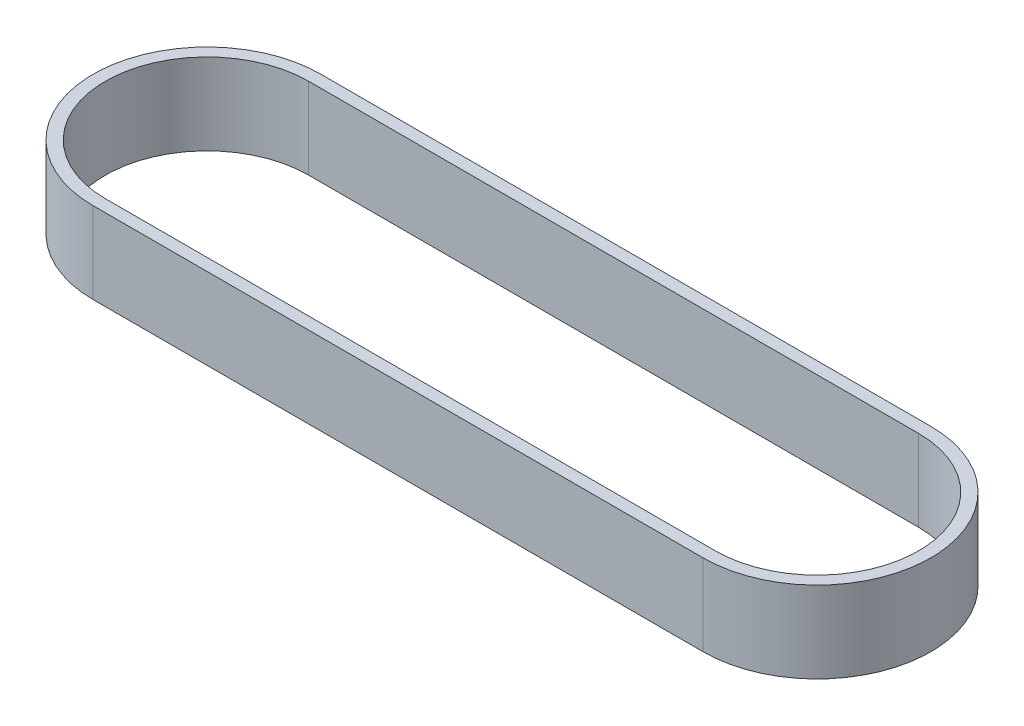
ISO-10303-21;
HEADER;
FILE_DESCRIPTION(('STEP AP214'),'2;1');
FILE_NAME('part.step','',(''),(''),'','','');
FILE_SCHEMA(('AUTOMOTIVE_DESIGN { 1 0 10303 214 1 1 1 1 }'));
ENDSEC;
DATA;
#1=APPLICATION_CONTEXT('core data for automotive mechanical design processes');
#2=APPLICATION_PROTOCOL_DEFINITION('international standard','automotive_design',2000,#1);
#3=PRODUCT_CONTEXT('',#1,'mechanical');
#4=PRODUCT('Part','Part','',(#3));
#5=PRODUCT_RELATED_PRODUCT_CATEGORY('part','',(#4));
#6=PRODUCT_DEFINITION_FORMATION('','',#4);
#7=PRODUCT_DEFINITION_CONTEXT('part definition',#1,'design');
#8=PRODUCT_DEFINITION('design','',#6,#7);
#9=PRODUCT_DEFINITION_SHAPE('','',#8);
#10=(LENGTH_UNIT() NAMED_UNIT(*) SI_UNIT(.MILLI.,.METRE.));
#11=(NAMED_UNIT(*) PLANE_ANGLE_UNIT() SI_UNIT($,.RADIAN.));
#12=(NAMED_UNIT(*) SI_UNIT($,.STERADIAN.) SOLID_ANGLE_UNIT());
#13=UNCERTAINTY_MEASURE_WITH_UNIT(LENGTH_MEASURE(1.E-05),#10,'distance_accuracy_value','');
#14=(GEOMETRIC_REPRESENTATION_CONTEXT(3) GLOBAL_UNCERTAINTY_ASSIGNED_CONTEXT((#13)) GLOBAL_UNIT_ASSIGNED_CONTEXT((#10,
#11,#12)) REPRESENTATION_CONTEXT('',''));
#15=CARTESIAN_POINT('',(0.,0.,0.));
#16=DIRECTION('',(0.,0.,1.));
#17=DIRECTION('',(1.,0.,0.));
#18=AXIS2_PLACEMENT_3D('',#15,#16,#17);
#19=CARTESIAN_POINT('',(-150.,40.,0.));
#20=DIRECTION('',(0.,1.,0.));
#21=DIRECTION('',(0.,0.,1.));
#22=AXIS2_PLACEMENT_3D('',#19,#20,#21);
#23=PLANE('',#22);
#24=CARTESIAN_POINT('',(-150.,40.,0.));
#25=DIRECTION('',(0.,1.,0.));
#26=DIRECTION('',(0.,0.,1.));
#27=AXIS2_PLACEMENT_3D('',#24,#25,#26);
#28=CIRCLE('',#27,56.);
#29=CARTESIAN_POINT('',(-150.,40.,-56.));
#30=VERTEX_POINT('',#29);
#31=CARTESIAN_POINT('',(-150.,40.,56.));
#32=VERTEX_POINT('',#31);
#33=EDGE_CURVE('E153',#30,#32,#28,.T.);
#34=ORIENTED_EDGE('',*,*,#33,.T.);
#35=DIRECTION('',(1.,0.,0.));
#36=VECTOR('',#35,1.);
#37=CARTESIAN_POINT('',(-150.,40.,56.));
#38=LINE('',#37,#36);
#39=CARTESIAN_POINT('',(150.,40.,56.));
#40=VERTEX_POINT('',#39);
#41=EDGE_CURVE('E157',#32,#40,#38,.T.);
#42=ORIENTED_EDGE('',*,*,#41,.T.);
#43=CARTESIAN_POINT('',(150.,40.,0.));
#44=DIRECTION('',(0.,1.,0.));
#45=DIRECTION('',(0.,0.,1.));
#46=AXIS2_PLACEMENT_3D('',#43,#44,#45);
#47=CIRCLE('',#46,56.);
#48=CARTESIAN_POINT('',(150.,40.,-56.));
#49=VERTEX_POINT('',#48);
#50=EDGE_CURVE('E161',#40,#49,#47,.T.);
#51=ORIENTED_EDGE('',*,*,#50,.T.);
#52=DIRECTION('',(-1.,0.,0.));
#53=VECTOR('',#52,1.);
#54=CARTESIAN_POINT('',(-150.,40.,-56.));
#55=LINE('',#54,#53);
#56=EDGE_CURVE('E164',#49,#30,#55,.T.);
#57=ORIENTED_EDGE('',*,*,#56,.T.);
#58=EDGE_LOOP('',(#34,#42,#51,#57));
#59=FACE_BOUND('',#58,.T.);
#60=DIRECTION('',(1.,0.,0.));
#61=VECTOR('',#60,1.);
#62=CARTESIAN_POINT('',(-150.,40.,50.));
#63=LINE('',#62,#61);
#64=CARTESIAN_POINT('',(-150.,40.,50.));
#65=VERTEX_POINT('',#64);
#66=CARTESIAN_POINT('',(150.,40.,50.));
#67=VERTEX_POINT('',#66);
#68=EDGE_CURVE('E114',#65,#67,#63,.T.);
#69=ORIENTED_EDGE('',*,*,#68,.F.);
#70=CARTESIAN_POINT('',(-150.,40.,0.));
#71=DIRECTION('',(0.,1.,0.));
#72=DIRECTION('',(0.,0.,1.));
#73=AXIS2_PLACEMENT_3D('',#70,#71,#72);
#74=CIRCLE('',#73,50.);
#75=CARTESIAN_POINT('',(-150.,40.,-50.));
#76=VERTEX_POINT('',#75);
#77=EDGE_CURVE('E105',#76,#65,#74,.T.);
#78=ORIENTED_EDGE('',*,*,#77,.F.);
#79=DIRECTION('',(-1.,0.,0.));
#80=VECTOR('',#79,1.);
#81=CARTESIAN_POINT('',(-150.,40.,-50.));
#82=LINE('',#81,#80);
#83=CARTESIAN_POINT('',(150.,40.,-50.));
#84=VERTEX_POINT('',#83);
#85=EDGE_CURVE('E131',#84,#76,#82,.T.);
#86=ORIENTED_EDGE('',*,*,#85,.F.);
#87=CARTESIAN_POINT('',(150.,40.,0.));
#88=DIRECTION('',(0.,1.,0.));
#89=DIRECTION('',(0.,0.,1.));
#90=AXIS2_PLACEMENT_3D('',#87,#88,#89);
#91=CIRCLE('',#90,50.);
#92=EDGE_CURVE('E127',#67,#84,#91,.T.);
#93=ORIENTED_EDGE('',*,*,#92,.F.);
#94=EDGE_LOOP('',(#69,#78,#86,#93));
#95=FACE_BOUND('',#94,.T.);
#96=ADVANCED_FACE('F39',(#59,#95),#23,.T.);
#97=CARTESIAN_POINT('',(-150.,0.,0.));
#98=DIRECTION('',(0.,1.,0.));
#99=DIRECTION('',(0.,0.,1.));
#100=AXIS2_PLACEMENT_3D('',#97,#98,#99);
#101=PLANE('',#100);
#102=CARTESIAN_POINT('',(-150.,0.,0.));
#103=DIRECTION('',(0.,1.,0.));
#104=DIRECTION('',(0.,0.,1.));
#105=AXIS2_PLACEMENT_3D('',#102,#103,#104);
#106=CIRCLE('',#105,56.);
#107=CARTESIAN_POINT('',(-150.,0.,-56.));
#108=VERTEX_POINT('',#107);
#109=CARTESIAN_POINT('',(-150.,0.,56.));
#110=VERTEX_POINT('',#109);
#111=EDGE_CURVE('E123',#108,#110,#106,.T.);
#112=ORIENTED_EDGE('',*,*,#111,.F.);
#113=DIRECTION('',(-1.,0.,0.));
#114=VECTOR('',#113,1.);
#115=CARTESIAN_POINT('',(-150.,0.,-56.));
#116=LINE('',#115,#114);
#117=CARTESIAN_POINT('',(150.,0.,-56.));
#118=VERTEX_POINT('',#117);
#119=EDGE_CURVE('E158',#118,#108,#116,.T.);
#120=ORIENTED_EDGE('',*,*,#119,.F.);
#121=CARTESIAN_POINT('',(150.,0.,0.));
#122=DIRECTION('',(0.,1.,0.));
#123=DIRECTION('',(0.,0.,1.));
#124=AXIS2_PLACEMENT_3D('',#121,#122,#123);
#125=CIRCLE('',#124,56.);
#126=CARTESIAN_POINT('',(150.,0.,56.));
#127=VERTEX_POINT('',#126);
#128=EDGE_CURVE('E174',#127,#118,#125,.T.);
#129=ORIENTED_EDGE('',*,*,#128,.F.);
#130=DIRECTION('',(1.,0.,0.));
#131=VECTOR('',#130,1.);
#132=CARTESIAN_POINT('',(-150.,0.,56.));
#133=LINE('',#132,#131);
#134=EDGE_CURVE('E171',#110,#127,#133,.T.);
#135=ORIENTED_EDGE('',*,*,#134,.F.);
#136=EDGE_LOOP('',(#112,#120,#129,#135));
#137=FACE_BOUND('',#136,.T.);
#138=CARTESIAN_POINT('',(-150.,0.,0.));
#139=DIRECTION('',(0.,1.,0.));
#140=DIRECTION('',(0.,0.,1.));
#141=AXIS2_PLACEMENT_3D('',#138,#139,#140);
#142=CIRCLE('',#141,50.);
#143=CARTESIAN_POINT('',(-150.,0.,-50.));
#144=VERTEX_POINT('',#143);
#145=CARTESIAN_POINT('',(-150.,0.,50.));
#146=VERTEX_POINT('',#145);
#147=EDGE_CURVE('E63',#144,#146,#142,.T.);
#148=ORIENTED_EDGE('',*,*,#147,.T.);
#149=DIRECTION('',(1.,0.,0.));
#150=VECTOR('',#149,1.);
#151=CARTESIAN_POINT('',(-150.,0.,50.));
#152=LINE('',#151,#150);
#153=CARTESIAN_POINT('',(150.,0.,50.));
#154=VERTEX_POINT('',#153);
#155=EDGE_CURVE('E121',#146,#154,#152,.T.);
#156=ORIENTED_EDGE('',*,*,#155,.T.);
#157=CARTESIAN_POINT('',(150.,0.,0.));
#158=DIRECTION('',(0.,1.,0.));
#159=DIRECTION('',(0.,0.,1.));
#160=AXIS2_PLACEMENT_3D('',#157,#158,#159);
#161=CIRCLE('',#160,50.);
#162=CARTESIAN_POINT('',(150.,0.,-50.));
#163=VERTEX_POINT('',#162);
#164=EDGE_CURVE('E140',#154,#163,#161,.T.);
#165=ORIENTED_EDGE('',*,*,#164,.T.);
#166=DIRECTION('',(-1.,0.,0.));
#167=VECTOR('',#166,1.);
#168=CARTESIAN_POINT('',(-150.,0.,-50.));
#169=LINE('',#168,#167);
#170=EDGE_CURVE('E115',#163,#144,#169,.T.);
#171=ORIENTED_EDGE('',*,*,#170,.T.);
#172=EDGE_LOOP('',(#148,#156,#165,#171));
#173=FACE_BOUND('',#172,.T.);
#174=ADVANCED_FACE('F197',(#137,#173),#101,.F.);
#175=CARTESIAN_POINT('',(-150.,40.,0.));
#176=DIRECTION('',(0.,-1.,0.));
#177=DIRECTION('',(0.,0.,-1.));
#178=AXIS2_PLACEMENT_3D('',#175,#176,#177);
#179=CYLINDRICAL_SURFACE('',#178,56.);
#180=ORIENTED_EDGE('',*,*,#111,.T.);
#181=DIRECTION('',(0.,-1.,0.));
#182=VECTOR('',#181,1.);
#183=CARTESIAN_POINT('',(-150.,40.,56.));
#184=LINE('',#183,#182);
#185=EDGE_CURVE('E11',#32,#110,#184,.T.);
#186=ORIENTED_EDGE('',*,*,#185,.F.);
#187=ORIENTED_EDGE('',*,*,#33,.F.);
#188=DIRECTION('',(0.,-1.,0.));
#189=VECTOR('',#188,1.);
#190=CARTESIAN_POINT('',(-150.,40.,-56.));
#191=LINE('',#190,#189);
#192=EDGE_CURVE('E167',#30,#108,#191,.T.);
#193=ORIENTED_EDGE('',*,*,#192,.T.);
#194=EDGE_LOOP('',(#180,#186,#187,#193));
#195=FACE_BOUND('',#194,.T.);
#196=ADVANCED_FACE('F41',(#195),#179,.T.);
#197=CARTESIAN_POINT('',(-150.,40.,56.));
#198=DIRECTION('',(0.,0.,-1.));
#199=DIRECTION('',(-1.,0.,0.));
#200=AXIS2_PLACEMENT_3D('',#197,#198,#199);
#201=PLANE('',#200);
#202=ORIENTED_EDGE('',*,*,#134,.T.);
#203=DIRECTION('',(0.,-1.,0.));
#204=VECTOR('',#203,1.);
#205=CARTESIAN_POINT('',(150.,40.,56.));
#206=LINE('',#205,#204);
#207=EDGE_CURVE('E48',#40,#127,#206,.T.);
#208=ORIENTED_EDGE('',*,*,#207,.F.);
#209=ORIENTED_EDGE('',*,*,#41,.F.);
#210=ORIENTED_EDGE('',*,*,#185,.T.);
#211=EDGE_LOOP('',(#202,#208,#209,#210));
#212=FACE_BOUND('',#211,.T.);
#213=ADVANCED_FACE('F207',(#212),#201,.F.);
#214=CARTESIAN_POINT('',(150.,40.,0.));
#215=DIRECTION('',(0.,-1.,0.));
#216=DIRECTION('',(0.,0.,-1.));
#217=AXIS2_PLACEMENT_3D('',#214,#215,#216);
#218=CYLINDRICAL_SURFACE('',#217,56.);
#219=ORIENTED_EDGE('',*,*,#128,.T.);
#220=DIRECTION('',(0.,-1.,0.));
#221=VECTOR('',#220,1.);
#222=CARTESIAN_POINT('',(150.,40.,-56.));
#223=LINE('',#222,#221);
#224=EDGE_CURVE('E182',#49,#118,#223,.T.);
#225=ORIENTED_EDGE('',*,*,#224,.F.);
#226=ORIENTED_EDGE('',*,*,#50,.F.);
#227=ORIENTED_EDGE('',*,*,#207,.T.);
#228=EDGE_LOOP('',(#219,#225,#226,#227));
#229=FACE_BOUND('',#228,.T.);
#230=ADVANCED_FACE('F191',(#229),#218,.T.);
#231=CARTESIAN_POINT('',(-150.,40.,-56.));
#232=DIRECTION('',(0.,0.,1.));
#233=DIRECTION('',(1.,0.,0.));
#234=AXIS2_PLACEMENT_3D('',#231,#232,#233);
#235=PLANE('',#234);
#236=ORIENTED_EDGE('',*,*,#119,.T.);
#237=ORIENTED_EDGE('',*,*,#192,.F.);
#238=ORIENTED_EDGE('',*,*,#56,.F.);
#239=ORIENTED_EDGE('',*,*,#224,.T.);
#240=EDGE_LOOP('',(#236,#237,#238,#239));
#241=FACE_BOUND('',#240,.T.);
#242=ADVANCED_FACE('F201',(#241),#235,.F.);
#243=CARTESIAN_POINT('',(-150.,40.,0.));
#244=DIRECTION('',(0.,-1.,0.));
#245=DIRECTION('',(0.,0.,-1.));
#246=AXIS2_PLACEMENT_3D('',#243,#244,#245);
#247=CYLINDRICAL_SURFACE('',#246,50.);
#248=ORIENTED_EDGE('',*,*,#147,.F.);
#249=DIRECTION('',(0.,-1.,0.));
#250=VECTOR('',#249,1.);
#251=CARTESIAN_POINT('',(-150.,40.,-50.));
#252=LINE('',#251,#250);
#253=EDGE_CURVE('E109',#76,#144,#252,.T.);
#254=ORIENTED_EDGE('',*,*,#253,.F.);
#255=ORIENTED_EDGE('',*,*,#77,.T.);
#256=DIRECTION('',(0.,-1.,0.));
#257=VECTOR('',#256,1.);
#258=CARTESIAN_POINT('',(-150.,40.,50.));
#259=LINE('',#258,#257);
#260=EDGE_CURVE('E108',#65,#146,#259,.T.);
#261=ORIENTED_EDGE('',*,*,#260,.T.);
#262=EDGE_LOOP('',(#248,#254,#255,#261));
#263=FACE_BOUND('',#262,.T.);
#264=ADVANCED_FACE('F107',(#263),#247,.F.);
#265=CARTESIAN_POINT('',(-150.,40.,50.));
#266=DIRECTION('',(0.,0.,-1.));
#267=DIRECTION('',(-1.,0.,0.));
#268=AXIS2_PLACEMENT_3D('',#265,#266,#267);
#269=PLANE('',#268);
#270=ORIENTED_EDGE('',*,*,#155,.F.);
#271=ORIENTED_EDGE('',*,*,#260,.F.);
#272=ORIENTED_EDGE('',*,*,#68,.T.);
#273=DIRECTION('',(0.,-1.,0.));
#274=VECTOR('',#273,1.);
#275=CARTESIAN_POINT('',(150.,40.,50.));
#276=LINE('',#275,#274);
#277=EDGE_CURVE('E124',#67,#154,#276,.T.);
#278=ORIENTED_EDGE('',*,*,#277,.T.);
#279=EDGE_LOOP('',(#270,#271,#272,#278));
#280=FACE_BOUND('',#279,.T.);
#281=ADVANCED_FACE('F118',(#280),#269,.T.);
#282=CARTESIAN_POINT('',(150.,40.,0.));
#283=DIRECTION('',(0.,-1.,0.));
#284=DIRECTION('',(0.,0.,-1.));
#285=AXIS2_PLACEMENT_3D('',#282,#283,#284);
#286=CYLINDRICAL_SURFACE('',#285,50.);
#287=ORIENTED_EDGE('',*,*,#164,.F.);
#288=ORIENTED_EDGE('',*,*,#277,.F.);
#289=ORIENTED_EDGE('',*,*,#92,.T.);
#290=DIRECTION('',(0.,-1.,0.));
#291=VECTOR('',#290,1.);
#292=CARTESIAN_POINT('',(150.,40.,-50.));
#293=LINE('',#292,#291);
#294=EDGE_CURVE('E55',#84,#163,#293,.T.);
#295=ORIENTED_EDGE('',*,*,#294,.T.);
#296=EDGE_LOOP('',(#287,#288,#289,#295));
#297=FACE_BOUND('',#296,.T.);
#298=ADVANCED_FACE('F230',(#297),#286,.F.);
#299=CARTESIAN_POINT('',(-150.,40.,-50.));
#300=DIRECTION('',(0.,0.,1.));
#301=DIRECTION('',(1.,0.,0.));
#302=AXIS2_PLACEMENT_3D('',#299,#300,#301);
#303=PLANE('',#302);
#304=ORIENTED_EDGE('',*,*,#170,.F.);
#305=ORIENTED_EDGE('',*,*,#294,.F.);
#306=ORIENTED_EDGE('',*,*,#85,.T.);
#307=ORIENTED_EDGE('',*,*,#253,.T.);
#308=EDGE_LOOP('',(#304,#305,#306,#307));
#309=FACE_BOUND('',#308,.T.);
#310=ADVANCED_FACE('F234',(#309),#303,.T.);
#311=CLOSED_SHELL('',(#96,#174,#196,#213,#230,#242,#264,#281,#298,#310));
#312=MANIFOLD_SOLID_BREP('B2',#311);
#313=ADVANCED_BREP_SHAPE_REPRESENTATION('',(#18,#312),#14);
#314=SHAPE_DEFINITION_REPRESENTATION(#9,#313);
ENDSEC;
END-ISO-10303-21;
